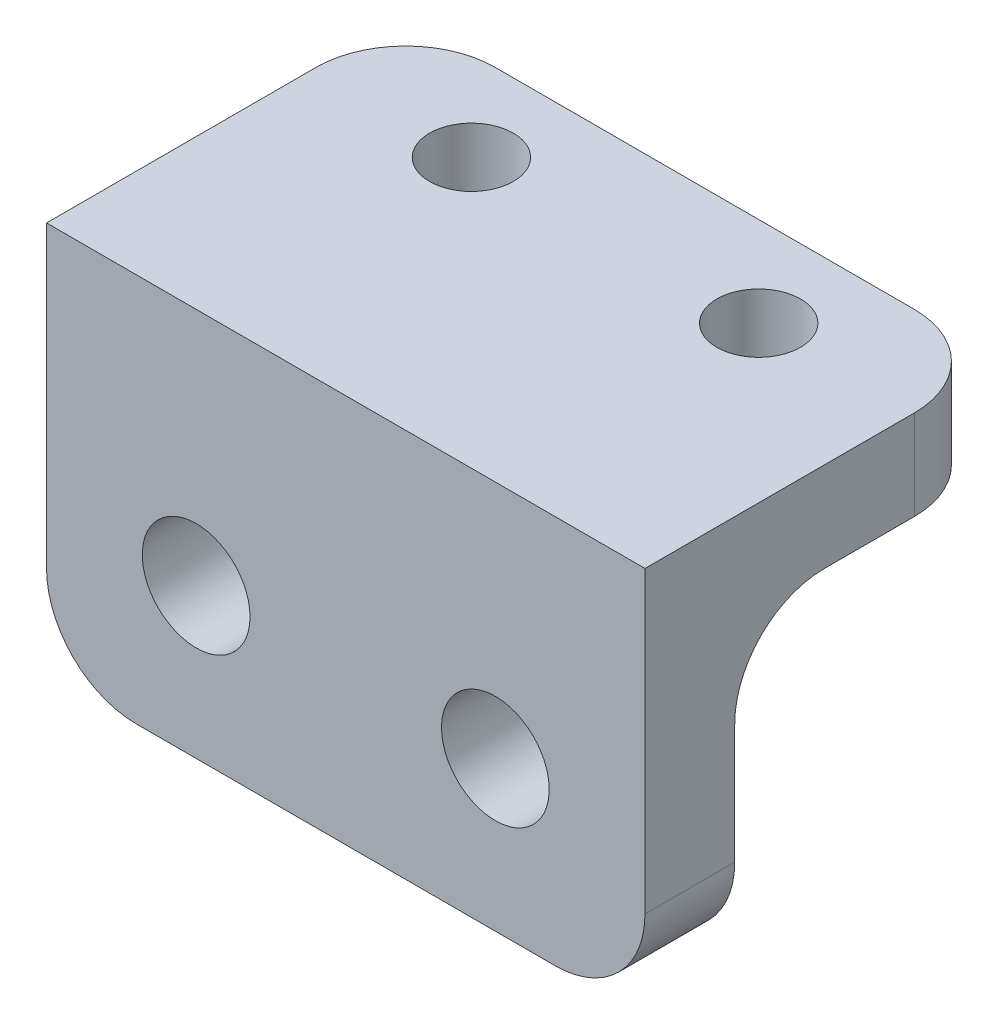
ISO-10303-21;
HEADER;
FILE_DESCRIPTION(('STEP AP214'),'2;1');
FILE_NAME('part.step','',(''),(''),'','','');
FILE_SCHEMA(('AUTOMOTIVE_DESIGN { 1 0 10303 214 1 1 1 1 }'));
ENDSEC;
DATA;
#1=APPLICATION_CONTEXT('core data for automotive mechanical design processes');
#2=APPLICATION_PROTOCOL_DEFINITION('international standard','automotive_design',2000,#1);
#3=PRODUCT_CONTEXT('',#1,'mechanical');
#4=PRODUCT('Part','Part','',(#3));
#5=PRODUCT_RELATED_PRODUCT_CATEGORY('part','',(#4));
#6=PRODUCT_DEFINITION_FORMATION('','',#4);
#7=PRODUCT_DEFINITION_CONTEXT('part definition',#1,'design');
#8=PRODUCT_DEFINITION('design','',#6,#7);
#9=PRODUCT_DEFINITION_SHAPE('','',#8);
#10=(LENGTH_UNIT() NAMED_UNIT(*) SI_UNIT(.MILLI.,.METRE.));
#11=(NAMED_UNIT(*) PLANE_ANGLE_UNIT() SI_UNIT($,.RADIAN.));
#12=(NAMED_UNIT(*) SI_UNIT($,.STERADIAN.) SOLID_ANGLE_UNIT());
#13=UNCERTAINTY_MEASURE_WITH_UNIT(LENGTH_MEASURE(1.E-05),#10,'distance_accuracy_value','');
#14=(GEOMETRIC_REPRESENTATION_CONTEXT(3) GLOBAL_UNCERTAINTY_ASSIGNED_CONTEXT((#13)) GLOBAL_UNIT_ASSIGNED_CONTEXT((#10,
#11,#12)) REPRESENTATION_CONTEXT('',''));
#15=CARTESIAN_POINT('',(0.,0.,0.));
#16=DIRECTION('',(0.,0.,1.));
#17=DIRECTION('',(1.,0.,0.));
#18=AXIS2_PLACEMENT_3D('',#15,#16,#17);
#19=CARTESIAN_POINT('',(0.,0.,3.));
#20=DIRECTION('',(0.,0.,-1.));
#21=DIRECTION('',(-1.,0.,0.));
#22=AXIS2_PLACEMENT_3D('',#19,#20,#21);
#23=PLANE('',#22);
#24=DIRECTION('',(0.,-1.,0.));
#25=VECTOR('',#24,1.);
#26=CARTESIAN_POINT('',(-10.,-5.,3.));
#27=LINE('',#26,#25);
#28=CARTESIAN_POINT('',(-10.,8.,3.));
#29=VERTEX_POINT('',#28);
#30=CARTESIAN_POINT('',(-10.,-2.,3.));
#31=VERTEX_POINT('',#30);
#32=EDGE_CURVE('E132',#29,#31,#27,.T.);
#33=ORIENTED_EDGE('',*,*,#32,.T.);
#34=CARTESIAN_POINT('',(-7.,-2.,3.));
#35=DIRECTION('',(0.,0.,-1.));
#36=DIRECTION('',(-1.,0.,0.));
#37=AXIS2_PLACEMENT_3D('',#34,#35,#36);
#38=CIRCLE('',#37,3.);
#39=CARTESIAN_POINT('',(-7.,-5.,3.));
#40=VERTEX_POINT('',#39);
#41=EDGE_CURVE('E198',#31,#40,#38,.F.);
#42=ORIENTED_EDGE('',*,*,#41,.T.);
#43=DIRECTION('',(1.,0.,0.));
#44=VECTOR('',#43,1.);
#45=CARTESIAN_POINT('',(-10.,-5.,3.));
#46=LINE('',#45,#44);
#47=CARTESIAN_POINT('',(7.,-5.,3.));
#48=VERTEX_POINT('',#47);
#49=EDGE_CURVE('E139',#40,#48,#46,.T.);
#50=ORIENTED_EDGE('',*,*,#49,.T.);
#51=CARTESIAN_POINT('',(7.,-2.,3.));
#52=DIRECTION('',(0.,0.,-1.));
#53=DIRECTION('',(-1.,0.,0.));
#54=AXIS2_PLACEMENT_3D('',#51,#52,#53);
#55=CIRCLE('',#54,3.);
#56=CARTESIAN_POINT('',(10.,-2.,3.));
#57=VERTEX_POINT('',#56);
#58=EDGE_CURVE('E196',#48,#57,#55,.F.);
#59=ORIENTED_EDGE('',*,*,#58,.T.);
#60=DIRECTION('',(0.,1.,0.));
#61=VECTOR('',#60,1.);
#62=CARTESIAN_POINT('',(10.,-5.,3.));
#63=LINE('',#62,#61);
#64=CARTESIAN_POINT('',(10.,8.,3.));
#65=VERTEX_POINT('',#64);
#66=EDGE_CURVE('E140',#57,#65,#63,.T.);
#67=ORIENTED_EDGE('',*,*,#66,.T.);
#68=DIRECTION('',(1.,0.,0.));
#69=VECTOR('',#68,1.);
#70=CARTESIAN_POINT('',(-10.,8.,3.));
#71=LINE('',#70,#69);
#72=EDGE_CURVE('E122',#29,#65,#71,.T.);
#73=ORIENTED_EDGE('',*,*,#72,.F.);
#74=EDGE_LOOP('',(#33,#42,#50,#59,#67,#73));
#75=FACE_BOUND('',#74,.T.);
#76=CARTESIAN_POINT('',(-5.,0.,3.));
#77=DIRECTION('',(0.,0.,1.));
#78=DIRECTION('',(1.,0.,0.));
#79=AXIS2_PLACEMENT_3D('',#76,#77,#78);
#80=CIRCLE('',#79,1.8);
#81=CARTESIAN_POINT('',(-3.2,0.,3.));
#82=VERTEX_POINT('',#81);
#83=EDGE_CURVE('E166',#82,#82,#80,.T.);
#84=ORIENTED_EDGE('',*,*,#83,.F.);
#85=EDGE_LOOP('',(#84));
#86=FACE_BOUND('',#85,.T.);
#87=CARTESIAN_POINT('',(4.99999999999999,0.,3.));
#88=DIRECTION('',(0.,0.,1.));
#89=DIRECTION('',(-1.,0.,0.));
#90=AXIS2_PLACEMENT_3D('',#87,#88,#89);
#91=CIRCLE('',#90,1.8);
#92=CARTESIAN_POINT('',(3.19999999999999,0.,3.));
#93=VERTEX_POINT('',#92);
#94=EDGE_CURVE('E160',#93,#93,#91,.T.);
#95=ORIENTED_EDGE('',*,*,#94,.F.);
#96=EDGE_LOOP('',(#95));
#97=FACE_BOUND('',#96,.T.);
#98=ADVANCED_FACE('F34',(#75,#86,#97),#23,.F.);
#99=CARTESIAN_POINT('',(0.,0.,0.));
#100=DIRECTION('',(0.,0.,-1.));
#101=DIRECTION('',(-1.,0.,0.));
#102=AXIS2_PLACEMENT_3D('',#99,#100,#101);
#103=PLANE('',#102);
#104=CARTESIAN_POINT('',(-5.,0.,0.));
#105=DIRECTION('',(0.,0.,1.));
#106=DIRECTION('',(1.,0.,0.));
#107=AXIS2_PLACEMENT_3D('',#104,#105,#106);
#108=CIRCLE('',#107,1.8);
#109=CARTESIAN_POINT('',(-3.2,0.,0.));
#110=VERTEX_POINT('',#109);
#111=EDGE_CURVE('E163',#110,#110,#108,.T.);
#112=ORIENTED_EDGE('',*,*,#111,.T.);
#113=EDGE_LOOP('',(#112));
#114=FACE_BOUND('',#113,.T.);
#115=DIRECTION('',(1.,0.,0.));
#116=VECTOR('',#115,1.);
#117=CARTESIAN_POINT('',(-10.,-5.,0.));
#118=LINE('',#117,#116);
#119=CARTESIAN_POINT('',(-7.,-5.,0.));
#120=VERTEX_POINT('',#119);
#121=CARTESIAN_POINT('',(7.,-5.,0.));
#122=VERTEX_POINT('',#121);
#123=EDGE_CURVE('E172',#120,#122,#118,.T.);
#124=ORIENTED_EDGE('',*,*,#123,.F.);
#125=CARTESIAN_POINT('',(-7.,-2.,0.));
#126=DIRECTION('',(0.,0.,-1.));
#127=DIRECTION('',(-1.,0.,0.));
#128=AXIS2_PLACEMENT_3D('',#125,#126,#127);
#129=CIRCLE('',#128,3.);
#130=CARTESIAN_POINT('',(-10.,-2.,0.));
#131=VERTEX_POINT('',#130);
#132=EDGE_CURVE('E191',#120,#131,#129,.T.);
#133=ORIENTED_EDGE('',*,*,#132,.T.);
#134=DIRECTION('',(0.,-1.,0.));
#135=VECTOR('',#134,1.);
#136=CARTESIAN_POINT('',(-10.,-5.,0.));
#137=LINE('',#136,#135);
#138=CARTESIAN_POINT('',(-10.,2.,0.));
#139=VERTEX_POINT('',#138);
#140=EDGE_CURVE('E179',#139,#131,#137,.T.);
#141=ORIENTED_EDGE('',*,*,#140,.F.);
#142=DIRECTION('',(-1.,0.,0.));
#143=VECTOR('',#142,1.);
#144=CARTESIAN_POINT('',(10.,2.,0.));
#145=LINE('',#144,#143);
#146=CARTESIAN_POINT('',(10.,2.,0.));
#147=VERTEX_POINT('',#146);
#148=EDGE_CURVE('E187',#139,#147,#145,.F.);
#149=ORIENTED_EDGE('',*,*,#148,.T.);
#150=DIRECTION('',(0.,1.,0.));
#151=VECTOR('',#150,1.);
#152=CARTESIAN_POINT('',(10.,-5.,0.));
#153=LINE('',#152,#151);
#154=CARTESIAN_POINT('',(10.,-2.,0.));
#155=VERTEX_POINT('',#154);
#156=EDGE_CURVE('E169',#155,#147,#153,.T.);
#157=ORIENTED_EDGE('',*,*,#156,.F.);
#158=CARTESIAN_POINT('',(7.,-2.,0.));
#159=DIRECTION('',(0.,0.,-1.));
#160=DIRECTION('',(-1.,0.,0.));
#161=AXIS2_PLACEMENT_3D('',#158,#159,#160);
#162=CIRCLE('',#161,3.);
#163=EDGE_CURVE('E189',#155,#122,#162,.T.);
#164=ORIENTED_EDGE('',*,*,#163,.T.);
#165=EDGE_LOOP('',(#124,#133,#141,#149,#157,#164));
#166=FACE_BOUND('',#165,.T.);
#167=CARTESIAN_POINT('',(4.99999999999999,0.,0.));
#168=DIRECTION('',(0.,0.,1.));
#169=DIRECTION('',(-1.,0.,0.));
#170=AXIS2_PLACEMENT_3D('',#167,#168,#169);
#171=CIRCLE('',#170,1.8);
#172=CARTESIAN_POINT('',(3.19999999999999,0.,0.));
#173=VERTEX_POINT('',#172);
#174=EDGE_CURVE('E151',#173,#173,#171,.T.);
#175=ORIENTED_EDGE('',*,*,#174,.T.);
#176=EDGE_LOOP('',(#175));
#177=FACE_BOUND('',#176,.T.);
#178=ADVANCED_FACE('F224',(#114,#166,#177),#103,.T.);
#179=CARTESIAN_POINT('',(10.,-5.,3.));
#180=DIRECTION('',(-1.,0.,0.));
#181=DIRECTION('',(0.,0.,1.));
#182=AXIS2_PLACEMENT_3D('',#179,#180,#181);
#183=PLANE('',#182);
#184=ORIENTED_EDGE('',*,*,#66,.F.);
#185=DIRECTION('',(0.,0.,-1.));
#186=VECTOR('',#185,1.);
#187=CARTESIAN_POINT('',(10.,-2.,3.));
#188=LINE('',#187,#186);
#189=EDGE_CURVE('E202',#57,#155,#188,.T.);
#190=ORIENTED_EDGE('',*,*,#189,.T.);
#191=ORIENTED_EDGE('',*,*,#156,.T.);
#192=CARTESIAN_POINT('',(10.,2.,-3.));
#193=DIRECTION('',(-1.,0.,0.));
#194=DIRECTION('',(0.,0.,1.));
#195=AXIS2_PLACEMENT_3D('',#192,#193,#194);
#196=CIRCLE('',#195,3.);
#197=CARTESIAN_POINT('',(10.,5.,-3.));
#198=VERTEX_POINT('',#197);
#199=EDGE_CURVE('E11',#147,#198,#196,.T.);
#200=ORIENTED_EDGE('',*,*,#199,.T.);
#201=DIRECTION('',(0.,0.,-1.));
#202=VECTOR('',#201,1.);
#203=CARTESIAN_POINT('',(10.,5.,3.));
#204=LINE('',#203,#202);
#205=CARTESIAN_POINT('',(10.,5.,-6.));
#206=VERTEX_POINT('',#205);
#207=EDGE_CURVE('E155',#198,#206,#204,.T.);
#208=ORIENTED_EDGE('',*,*,#207,.T.);
#209=DIRECTION('',(0.,-1.,0.));
#210=VECTOR('',#209,1.);
#211=CARTESIAN_POINT('',(10.,-5.,-6.));
#212=LINE('',#211,#210);
#213=CARTESIAN_POINT('',(10.,8.,-6.));
#214=VERTEX_POINT('',#213);
#215=EDGE_CURVE('E200',#206,#214,#212,.F.);
#216=ORIENTED_EDGE('',*,*,#215,.T.);
#217=DIRECTION('',(0.,0.,-1.));
#218=VECTOR('',#217,1.);
#219=CARTESIAN_POINT('',(10.,8.,3.));
#220=LINE('',#219,#218);
#221=EDGE_CURVE('E144',#65,#214,#220,.T.);
#222=ORIENTED_EDGE('',*,*,#221,.F.);
#223=EDGE_LOOP('',(#184,#190,#191,#200,#208,#216,#222));
#224=FACE_BOUND('',#223,.T.);
#225=ADVANCED_FACE('F230',(#224),#183,.F.);
#226=CARTESIAN_POINT('',(-10.,-5.,3.));
#227=DIRECTION('',(1.,0.,0.));
#228=DIRECTION('',(0.,0.,-1.));
#229=AXIS2_PLACEMENT_3D('',#226,#227,#228);
#230=PLANE('',#229);
#231=ORIENTED_EDGE('',*,*,#140,.T.);
#232=DIRECTION('',(0.,0.,-1.));
#233=VECTOR('',#232,1.);
#234=CARTESIAN_POINT('',(-10.,-2.,3.));
#235=LINE('',#234,#233);
#236=EDGE_CURVE('E136',#131,#31,#235,.F.);
#237=ORIENTED_EDGE('',*,*,#236,.T.);
#238=ORIENTED_EDGE('',*,*,#32,.F.);
#239=DIRECTION('',(0.,0.,1.));
#240=VECTOR('',#239,1.);
#241=CARTESIAN_POINT('',(-10.,8.,3.));
#242=LINE('',#241,#240);
#243=CARTESIAN_POINT('',(-10.,8.,-6.));
#244=VERTEX_POINT('',#243);
#245=EDGE_CURVE('E117',#244,#29,#242,.T.);
#246=ORIENTED_EDGE('',*,*,#245,.F.);
#247=DIRECTION('',(0.,-1.,0.));
#248=VECTOR('',#247,1.);
#249=CARTESIAN_POINT('',(-10.,-5.,-6.));
#250=LINE('',#249,#248);
#251=CARTESIAN_POINT('',(-10.,5.,-6.));
#252=VERTEX_POINT('',#251);
#253=EDGE_CURVE('E193',#244,#252,#250,.T.);
#254=ORIENTED_EDGE('',*,*,#253,.T.);
#255=DIRECTION('',(0.,0.,1.));
#256=VECTOR('',#255,1.);
#257=CARTESIAN_POINT('',(-10.,5.,3.));
#258=LINE('',#257,#256);
#259=CARTESIAN_POINT('',(-10.,5.,-3.));
#260=VERTEX_POINT('',#259);
#261=EDGE_CURVE('E152',#252,#260,#258,.T.);
#262=ORIENTED_EDGE('',*,*,#261,.T.);
#263=CARTESIAN_POINT('',(-10.,2.,-3.));
#264=DIRECTION('',(1.,0.,0.));
#265=DIRECTION('',(0.,0.,-1.));
#266=AXIS2_PLACEMENT_3D('',#263,#264,#265);
#267=CIRCLE('',#266,3.);
#268=EDGE_CURVE('E42',#260,#139,#267,.T.);
#269=ORIENTED_EDGE('',*,*,#268,.T.);
#270=EDGE_LOOP('',(#231,#237,#238,#246,#254,#262,#269));
#271=FACE_BOUND('',#270,.T.);
#272=ADVANCED_FACE('F134',(#271),#230,.F.);
#273=CARTESIAN_POINT('',(-10.,-5.,3.));
#274=DIRECTION('',(0.,1.,0.));
#275=DIRECTION('',(0.,0.,1.));
#276=AXIS2_PLACEMENT_3D('',#273,#274,#275);
#277=PLANE('',#276);
#278=ORIENTED_EDGE('',*,*,#49,.F.);
#279=DIRECTION('',(0.,0.,-1.));
#280=VECTOR('',#279,1.);
#281=CARTESIAN_POINT('',(-7.,-5.,3.));
#282=LINE('',#281,#280);
#283=EDGE_CURVE('E184',#40,#120,#282,.T.);
#284=ORIENTED_EDGE('',*,*,#283,.T.);
#285=ORIENTED_EDGE('',*,*,#123,.T.);
#286=DIRECTION('',(0.,0.,-1.));
#287=VECTOR('',#286,1.);
#288=CARTESIAN_POINT('',(7.,-5.,3.));
#289=LINE('',#288,#287);
#290=EDGE_CURVE('E176',#122,#48,#289,.F.);
#291=ORIENTED_EDGE('',*,*,#290,.T.);
#292=EDGE_LOOP('',(#278,#284,#285,#291));
#293=FACE_BOUND('',#292,.T.);
#294=ADVANCED_FACE('F263',(#293),#277,.F.);
#295=CARTESIAN_POINT('',(-5.,0.,3.));
#296=DIRECTION('',(0.,0.,-1.));
#297=DIRECTION('',(-1.,0.,0.));
#298=AXIS2_PLACEMENT_3D('',#295,#296,#297);
#299=CYLINDRICAL_SURFACE('',#298,1.8);
#300=ORIENTED_EDGE('',*,*,#83,.T.);
#301=EDGE_LOOP('',(#300));
#302=FACE_BOUND('',#301,.T.);
#303=ORIENTED_EDGE('',*,*,#111,.F.);
#304=EDGE_LOOP('',(#303));
#305=FACE_BOUND('',#304,.T.);
#306=ADVANCED_FACE('F260',(#302,#305),#299,.F.);
#307=CARTESIAN_POINT('',(4.99999999999999,0.,3.));
#308=DIRECTION('',(0.,0.,-1.));
#309=DIRECTION('',(-1.,0.,0.));
#310=AXIS2_PLACEMENT_3D('',#307,#308,#309);
#311=CYLINDRICAL_SURFACE('',#310,1.8);
#312=ORIENTED_EDGE('',*,*,#94,.T.);
#313=EDGE_LOOP('',(#312));
#314=FACE_BOUND('',#313,.T.);
#315=ORIENTED_EDGE('',*,*,#174,.F.);
#316=EDGE_LOOP('',(#315));
#317=FACE_BOUND('',#316,.T.);
#318=ADVANCED_FACE('F295',(#314,#317),#311,.F.);
#319=CARTESIAN_POINT('',(0.,8.,0.));
#320=DIRECTION('',(0.,-1.,0.));
#321=DIRECTION('',(0.,0.,-1.));
#322=AXIS2_PLACEMENT_3D('',#319,#320,#321);
#323=PLANE('',#322);
#324=DIRECTION('',(-1.,0.,0.));
#325=VECTOR('',#324,1.);
#326=CARTESIAN_POINT('',(-10.,8.,-9.));
#327=LINE('',#326,#325);
#328=CARTESIAN_POINT('',(7.,8.,-9.));
#329=VERTEX_POINT('',#328);
#330=CARTESIAN_POINT('',(-7.,8.,-9.));
#331=VERTEX_POINT('',#330);
#332=EDGE_CURVE('E146',#329,#331,#327,.T.);
#333=ORIENTED_EDGE('',*,*,#332,.T.);
#334=CARTESIAN_POINT('',(-7.,8.,-6.));
#335=DIRECTION('',(0.,-1.,0.));
#336=DIRECTION('',(0.,0.,-1.));
#337=AXIS2_PLACEMENT_3D('',#334,#335,#336);
#338=CIRCLE('',#337,3.);
#339=EDGE_CURVE('E125',#331,#244,#338,.F.);
#340=ORIENTED_EDGE('',*,*,#339,.T.);
#341=ORIENTED_EDGE('',*,*,#245,.T.);
#342=ORIENTED_EDGE('',*,*,#72,.T.);
#343=ORIENTED_EDGE('',*,*,#221,.T.);
#344=CARTESIAN_POINT('',(7.,8.,-6.));
#345=DIRECTION('',(0.,-1.,0.));
#346=DIRECTION('',(0.,0.,-1.));
#347=AXIS2_PLACEMENT_3D('',#344,#345,#346);
#348=CIRCLE('',#347,3.);
#349=EDGE_CURVE('E56',#214,#329,#348,.F.);
#350=ORIENTED_EDGE('',*,*,#349,.T.);
#351=EDGE_LOOP('',(#333,#340,#341,#342,#343,#350));
#352=FACE_BOUND('',#351,.T.);
#353=CARTESIAN_POINT('',(4.8,8.,-6.));
#354=DIRECTION('',(0.,1.,0.));
#355=DIRECTION('',(0.,0.,1.));
#356=AXIS2_PLACEMENT_3D('',#353,#354,#355);
#357=CIRCLE('',#356,1.4);
#358=CARTESIAN_POINT('',(4.8,8.,-4.6));
#359=VERTEX_POINT('',#358);
#360=EDGE_CURVE('E156',#359,#359,#357,.T.);
#361=ORIENTED_EDGE('',*,*,#360,.F.);
#362=EDGE_LOOP('',(#361));
#363=FACE_BOUND('',#362,.T.);
#364=CARTESIAN_POINT('',(-4.8,8.,-6.));
#365=DIRECTION('',(0.,1.,0.));
#366=DIRECTION('',(0.,0.,-1.));
#367=AXIS2_PLACEMENT_3D('',#364,#365,#366);
#368=CIRCLE('',#367,1.4);
#369=CARTESIAN_POINT('',(-4.8,8.,-7.4));
#370=VERTEX_POINT('',#369);
#371=EDGE_CURVE('E419',#370,#370,#368,.T.);
#372=ORIENTED_EDGE('',*,*,#371,.F.);
#373=EDGE_LOOP('',(#372));
#374=FACE_BOUND('',#373,.T.);
#375=ADVANCED_FACE('F119',(#352,#363,#374),#323,.F.);
#376=CARTESIAN_POINT('',(0.,5.,0.));
#377=DIRECTION('',(0.,-1.,0.));
#378=DIRECTION('',(0.,0.,-1.));
#379=AXIS2_PLACEMENT_3D('',#376,#377,#378);
#380=PLANE('',#379);
#381=CARTESIAN_POINT('',(4.8,5.,-6.));
#382=DIRECTION('',(0.,1.,0.));
#383=DIRECTION('',(0.,0.,1.));
#384=AXIS2_PLACEMENT_3D('',#381,#382,#383);
#385=CIRCLE('',#384,1.4);
#386=CARTESIAN_POINT('',(4.8,5.,-4.6));
#387=VERTEX_POINT('',#386);
#388=EDGE_CURVE('E417',#387,#387,#385,.T.);
#389=ORIENTED_EDGE('',*,*,#388,.T.);
#390=EDGE_LOOP('',(#389));
#391=FACE_BOUND('',#390,.T.);
#392=ORIENTED_EDGE('',*,*,#261,.F.);
#393=CARTESIAN_POINT('',(-7.,5.,-6.));
#394=DIRECTION('',(0.,-1.,0.));
#395=DIRECTION('',(0.,0.,-1.));
#396=AXIS2_PLACEMENT_3D('',#393,#394,#395);
#397=CIRCLE('',#396,3.);
#398=CARTESIAN_POINT('',(-7.,5.,-9.));
#399=VERTEX_POINT('',#398);
#400=EDGE_CURVE('E210',#252,#399,#397,.T.);
#401=ORIENTED_EDGE('',*,*,#400,.T.);
#402=DIRECTION('',(-1.,0.,0.));
#403=VECTOR('',#402,1.);
#404=CARTESIAN_POINT('',(-10.,5.,-9.));
#405=LINE('',#404,#403);
#406=CARTESIAN_POINT('',(7.,5.,-9.));
#407=VERTEX_POINT('',#406);
#408=EDGE_CURVE('E129',#407,#399,#405,.T.);
#409=ORIENTED_EDGE('',*,*,#408,.F.);
#410=CARTESIAN_POINT('',(7.,5.,-6.));
#411=DIRECTION('',(0.,-1.,0.));
#412=DIRECTION('',(0.,0.,-1.));
#413=AXIS2_PLACEMENT_3D('',#410,#411,#412);
#414=CIRCLE('',#413,3.);
#415=EDGE_CURVE('E208',#407,#206,#414,.T.);
#416=ORIENTED_EDGE('',*,*,#415,.T.);
#417=ORIENTED_EDGE('',*,*,#207,.F.);
#418=DIRECTION('',(-1.,0.,0.));
#419=VECTOR('',#418,1.);
#420=CARTESIAN_POINT('',(-10.,5.,-3.));
#421=LINE('',#420,#419);
#422=EDGE_CURVE('E205',#198,#260,#421,.T.);
#423=ORIENTED_EDGE('',*,*,#422,.T.);
#424=EDGE_LOOP('',(#392,#401,#409,#416,#417,#423));
#425=FACE_BOUND('',#424,.T.);
#426=CARTESIAN_POINT('',(-4.8,5.,-6.));
#427=DIRECTION('',(0.,1.,0.));
#428=DIRECTION('',(0.,0.,-1.));
#429=AXIS2_PLACEMENT_3D('',#426,#427,#428);
#430=CIRCLE('',#429,1.4);
#431=CARTESIAN_POINT('',(-4.8,5.,-7.4));
#432=VERTEX_POINT('',#431);
#433=EDGE_CURVE('E422',#432,#432,#430,.T.);
#434=ORIENTED_EDGE('',*,*,#433,.T.);
#435=EDGE_LOOP('',(#434));
#436=FACE_BOUND('',#435,.T.);
#437=ADVANCED_FACE('F233',(#391,#425,#436),#380,.T.);
#438=CARTESIAN_POINT('',(-10.,8.,-9.));
#439=DIRECTION('',(0.,0.,1.));
#440=DIRECTION('',(1.,0.,0.));
#441=AXIS2_PLACEMENT_3D('',#438,#439,#440);
#442=PLANE('',#441);
#443=ORIENTED_EDGE('',*,*,#408,.T.);
#444=DIRECTION('',(0.,-1.,0.));
#445=VECTOR('',#444,1.);
#446=CARTESIAN_POINT('',(-7.,8.,-9.));
#447=LINE('',#446,#445);
#448=EDGE_CURVE('E49',#399,#331,#447,.F.);
#449=ORIENTED_EDGE('',*,*,#448,.T.);
#450=ORIENTED_EDGE('',*,*,#332,.F.);
#451=DIRECTION('',(0.,-1.,0.));
#452=VECTOR('',#451,1.);
#453=CARTESIAN_POINT('',(7.,8.,-9.));
#454=LINE('',#453,#452);
#455=EDGE_CURVE('E212',#329,#407,#454,.T.);
#456=ORIENTED_EDGE('',*,*,#455,.T.);
#457=EDGE_LOOP('',(#443,#449,#450,#456));
#458=FACE_BOUND('',#457,.T.);
#459=ADVANCED_FACE('F239',(#458),#442,.F.);
#460=CARTESIAN_POINT('',(4.8,8.,-6.));
#461=DIRECTION('',(0.,-1.,0.));
#462=DIRECTION('',(0.,0.,-1.));
#463=AXIS2_PLACEMENT_3D('',#460,#461,#462);
#464=CYLINDRICAL_SURFACE('',#463,1.4);
#465=ORIENTED_EDGE('',*,*,#360,.T.);
#466=EDGE_LOOP('',(#465));
#467=FACE_BOUND('',#466,.T.);
#468=ORIENTED_EDGE('',*,*,#388,.F.);
#469=EDGE_LOOP('',(#468));
#470=FACE_BOUND('',#469,.T.);
#471=ADVANCED_FACE('F277',(#467,#470),#464,.F.);
#472=CARTESIAN_POINT('',(-4.8,8.,-6.));
#473=DIRECTION('',(0.,-1.,0.));
#474=DIRECTION('',(0.,0.,-1.));
#475=AXIS2_PLACEMENT_3D('',#472,#473,#474);
#476=CYLINDRICAL_SURFACE('',#475,1.4);
#477=ORIENTED_EDGE('',*,*,#371,.T.);
#478=EDGE_LOOP('',(#477));
#479=FACE_BOUND('',#478,.T.);
#480=ORIENTED_EDGE('',*,*,#433,.F.);
#481=EDGE_LOOP('',(#480));
#482=FACE_BOUND('',#481,.T.);
#483=ADVANCED_FACE('F272',(#479,#482),#476,.F.);
#484=CARTESIAN_POINT('',(-7.,-2.,3.));
#485=DIRECTION('',(0.,0.,-1.));
#486=DIRECTION('',(-1.,0.,0.));
#487=AXIS2_PLACEMENT_3D('',#484,#485,#486);
#488=CYLINDRICAL_SURFACE('',#487,3.);
#489=ORIENTED_EDGE('',*,*,#41,.F.);
#490=ORIENTED_EDGE('',*,*,#236,.F.);
#491=ORIENTED_EDGE('',*,*,#132,.F.);
#492=ORIENTED_EDGE('',*,*,#283,.F.);
#493=EDGE_LOOP('',(#489,#490,#491,#492));
#494=FACE_BOUND('',#493,.T.);
#495=ADVANCED_FACE('F249',(#494),#488,.T.);
#496=CARTESIAN_POINT('',(7.,-2.,3.));
#497=DIRECTION('',(0.,0.,-1.));
#498=DIRECTION('',(-1.,0.,0.));
#499=AXIS2_PLACEMENT_3D('',#496,#497,#498);
#500=CYLINDRICAL_SURFACE('',#499,3.);
#501=ORIENTED_EDGE('',*,*,#58,.F.);
#502=ORIENTED_EDGE('',*,*,#290,.F.);
#503=ORIENTED_EDGE('',*,*,#163,.F.);
#504=ORIENTED_EDGE('',*,*,#189,.F.);
#505=EDGE_LOOP('',(#501,#502,#503,#504));
#506=FACE_BOUND('',#505,.T.);
#507=ADVANCED_FACE('F243',(#506),#500,.T.);
#508=CARTESIAN_POINT('',(-7.,-5.,-6.));
#509=DIRECTION('',(0.,-1.,0.));
#510=DIRECTION('',(0.,0.,-1.));
#511=AXIS2_PLACEMENT_3D('',#508,#509,#510);
#512=CYLINDRICAL_SURFACE('',#511,3.);
#513=ORIENTED_EDGE('',*,*,#339,.F.);
#514=ORIENTED_EDGE('',*,*,#448,.F.);
#515=ORIENTED_EDGE('',*,*,#400,.F.);
#516=ORIENTED_EDGE('',*,*,#253,.F.);
#517=EDGE_LOOP('',(#513,#514,#515,#516));
#518=FACE_BOUND('',#517,.T.);
#519=ADVANCED_FACE('F241',(#518),#512,.T.);
#520=CARTESIAN_POINT('',(7.,8.,-6.));
#521=DIRECTION('',(0.,-1.,0.));
#522=DIRECTION('',(0.,0.,-1.));
#523=AXIS2_PLACEMENT_3D('',#520,#521,#522);
#524=CYLINDRICAL_SURFACE('',#523,3.);
#525=ORIENTED_EDGE('',*,*,#349,.F.);
#526=ORIENTED_EDGE('',*,*,#215,.F.);
#527=ORIENTED_EDGE('',*,*,#415,.F.);
#528=ORIENTED_EDGE('',*,*,#455,.F.);
#529=EDGE_LOOP('',(#525,#526,#527,#528));
#530=FACE_BOUND('',#529,.T.);
#531=ADVANCED_FACE('F238',(#530),#524,.T.);
#532=CARTESIAN_POINT('',(0.,2.,-3.));
#533=DIRECTION('',(1.,0.,0.));
#534=DIRECTION('',(0.,0.,-1.));
#535=AXIS2_PLACEMENT_3D('',#532,#533,#534);
#536=CYLINDRICAL_SURFACE('',#535,3.);
#537=ORIENTED_EDGE('',*,*,#199,.F.);
#538=ORIENTED_EDGE('',*,*,#148,.F.);
#539=ORIENTED_EDGE('',*,*,#268,.F.);
#540=ORIENTED_EDGE('',*,*,#422,.F.);
#541=EDGE_LOOP('',(#537,#538,#539,#540));
#542=FACE_BOUND('',#541,.T.);
#543=ADVANCED_FACE('F36',(#542),#536,.F.);
#544=CLOSED_SHELL('',(#98,#178,#225,#272,#294,#306,#318,#375,#437,#459,#471,#483,#495,#507,#519,
#531,#543));
#545=MANIFOLD_SOLID_BREP('B2',#544);
#546=ADVANCED_BREP_SHAPE_REPRESENTATION('',(#18,#545),#14);
#547=SHAPE_DEFINITION_REPRESENTATION(#9,#546);
ENDSEC;
END-ISO-10303-21;
